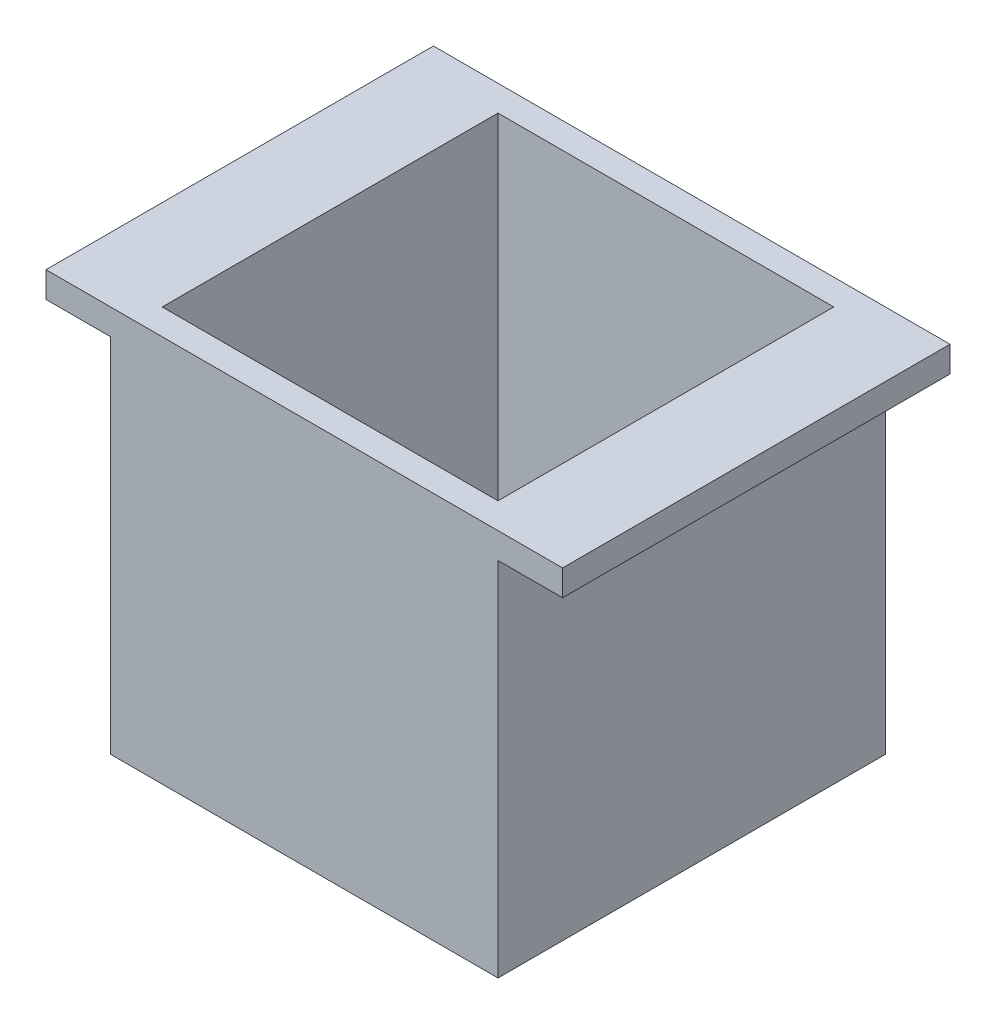
ISO-10303-21;
HEADER;
FILE_DESCRIPTION(('STEP AP214'),'2;1');
FILE_NAME('part.step','',(''),(''),'','','');
FILE_SCHEMA(('AUTOMOTIVE_DESIGN { 1 0 10303 214 1 1 1 1 }'));
ENDSEC;
DATA;
#1=APPLICATION_CONTEXT('core data for automotive mechanical design processes');
#2=APPLICATION_PROTOCOL_DEFINITION('international standard','automotive_design',2000,#1);
#3=PRODUCT_CONTEXT('',#1,'mechanical');
#4=PRODUCT('Part','Part','',(#3));
#5=PRODUCT_RELATED_PRODUCT_CATEGORY('part','',(#4));
#6=PRODUCT_DEFINITION_FORMATION('','',#4);
#7=PRODUCT_DEFINITION_CONTEXT('part definition',#1,'design');
#8=PRODUCT_DEFINITION('design','',#6,#7);
#9=PRODUCT_DEFINITION_SHAPE('','',#8);
#10=(LENGTH_UNIT() NAMED_UNIT(*) SI_UNIT(.MILLI.,.METRE.));
#11=(NAMED_UNIT(*) PLANE_ANGLE_UNIT() SI_UNIT($,.RADIAN.));
#12=(NAMED_UNIT(*) SI_UNIT($,.STERADIAN.) SOLID_ANGLE_UNIT());
#13=UNCERTAINTY_MEASURE_WITH_UNIT(LENGTH_MEASURE(1.E-05),#10,'distance_accuracy_value','');
#14=(GEOMETRIC_REPRESENTATION_CONTEXT(3) GLOBAL_UNCERTAINTY_ASSIGNED_CONTEXT((#13)) GLOBAL_UNIT_ASSIGNED_CONTEXT((#10,
#11,#12)) REPRESENTATION_CONTEXT('',''));
#15=CARTESIAN_POINT('',(0.,0.,0.));
#16=DIRECTION('',(0.,0.,1.));
#17=DIRECTION('',(1.,0.,0.));
#18=AXIS2_PLACEMENT_3D('',#15,#16,#17);
#19=CARTESIAN_POINT('',(30.,0.,30.));
#20=DIRECTION('',(0.,1.,0.));
#21=DIRECTION('',(0.,0.,1.));
#22=AXIS2_PLACEMENT_3D('',#19,#20,#21);
#23=PLANE('',#22);
#24=DIRECTION('',(1.,0.,0.));
#25=VECTOR('',#24,1.);
#26=CARTESIAN_POINT('',(30.,0.,0.));
#27=LINE('',#26,#25);
#28=CARTESIAN_POINT('',(0.,0.,0.));
#29=VERTEX_POINT('',#28);
#30=CARTESIAN_POINT('',(30.,0.,0.));
#31=VERTEX_POINT('',#30);
#32=EDGE_CURVE('E152',#29,#31,#27,.T.);
#33=ORIENTED_EDGE('',*,*,#32,.T.);
#34=DIRECTION('',(0.,0.,-1.));
#35=VECTOR('',#34,1.);
#36=CARTESIAN_POINT('',(30.,0.,30.));
#37=LINE('',#36,#35);
#38=CARTESIAN_POINT('',(30.,0.,30.));
#39=VERTEX_POINT('',#38);
#40=EDGE_CURVE('E11',#39,#31,#37,.T.);
#41=ORIENTED_EDGE('',*,*,#40,.F.);
#42=DIRECTION('',(1.,0.,0.));
#43=VECTOR('',#42,1.);
#44=CARTESIAN_POINT('',(30.,0.,30.));
#45=LINE('',#44,#43);
#46=CARTESIAN_POINT('',(0.,0.,30.));
#47=VERTEX_POINT('',#46);
#48=EDGE_CURVE('E176',#47,#39,#45,.T.);
#49=ORIENTED_EDGE('',*,*,#48,.F.);
#50=DIRECTION('',(0.,0.,-1.));
#51=VECTOR('',#50,1.);
#52=CARTESIAN_POINT('',(0.,0.,30.));
#53=LINE('',#52,#51);
#54=EDGE_CURVE('E148',#47,#29,#53,.T.);
#55=ORIENTED_EDGE('',*,*,#54,.T.);
#56=EDGE_LOOP('',(#33,#41,#49,#55));
#57=FACE_BOUND('',#56,.T.);
#58=ADVANCED_FACE('F39',(#57),#23,.F.);
#59=CARTESIAN_POINT('',(30.,28.,30.));
#60=DIRECTION('',(-1.,0.,0.));
#61=DIRECTION('',(0.,-1.,0.));
#62=AXIS2_PLACEMENT_3D('',#59,#60,#61);
#63=PLANE('',#62);
#64=DIRECTION('',(0.,1.,0.));
#65=VECTOR('',#64,1.);
#66=CARTESIAN_POINT('',(30.,28.,0.));
#67=LINE('',#66,#65);
#68=CARTESIAN_POINT('',(30.,28.,0.));
#69=VERTEX_POINT('',#68);
#70=EDGE_CURVE('E156',#31,#69,#67,.T.);
#71=ORIENTED_EDGE('',*,*,#70,.T.);
#72=DIRECTION('',(0.,0.,-1.));
#73=VECTOR('',#72,1.);
#74=CARTESIAN_POINT('',(30.,28.,30.));
#75=LINE('',#74,#73);
#76=CARTESIAN_POINT('',(30.,28.,30.));
#77=VERTEX_POINT('',#76);
#78=EDGE_CURVE('E47',#77,#69,#75,.T.);
#79=ORIENTED_EDGE('',*,*,#78,.F.);
#80=DIRECTION('',(0.,1.,0.));
#81=VECTOR('',#80,1.);
#82=CARTESIAN_POINT('',(30.,28.,30.));
#83=LINE('',#82,#81);
#84=EDGE_CURVE('E104',#39,#77,#83,.T.);
#85=ORIENTED_EDGE('',*,*,#84,.F.);
#86=ORIENTED_EDGE('',*,*,#40,.T.);
#87=EDGE_LOOP('',(#71,#79,#85,#86));
#88=FACE_BOUND('',#87,.T.);
#89=ADVANCED_FACE('F302',(#88),#63,.F.);
#90=CARTESIAN_POINT('',(35.,28.,30.));
#91=DIRECTION('',(0.,1.,0.));
#92=DIRECTION('',(0.,0.,1.));
#93=AXIS2_PLACEMENT_3D('',#90,#91,#92);
#94=PLANE('',#93);
#95=DIRECTION('',(1.,0.,0.));
#96=VECTOR('',#95,1.);
#97=CARTESIAN_POINT('',(35.,28.,0.));
#98=LINE('',#97,#96);
#99=CARTESIAN_POINT('',(35.,28.,0.));
#100=VERTEX_POINT('',#99);
#101=EDGE_CURVE('E160',#69,#100,#98,.T.);
#102=ORIENTED_EDGE('',*,*,#101,.T.);
#103=DIRECTION('',(0.,0.,-1.));
#104=VECTOR('',#103,1.);
#105=CARTESIAN_POINT('',(35.,28.,30.));
#106=LINE('',#105,#104);
#107=CARTESIAN_POINT('',(35.,28.,30.));
#108=VERTEX_POINT('',#107);
#109=EDGE_CURVE('E187',#108,#100,#106,.T.);
#110=ORIENTED_EDGE('',*,*,#109,.F.);
#111=DIRECTION('',(1.,0.,0.));
#112=VECTOR('',#111,1.);
#113=CARTESIAN_POINT('',(35.,28.,30.));
#114=LINE('',#113,#112);
#115=EDGE_CURVE('E197',#77,#108,#114,.T.);
#116=ORIENTED_EDGE('',*,*,#115,.F.);
#117=ORIENTED_EDGE('',*,*,#78,.T.);
#118=EDGE_LOOP('',(#102,#110,#116,#117));
#119=FACE_BOUND('',#118,.T.);
#120=ADVANCED_FACE('F195',(#119),#94,.F.);
#121=CARTESIAN_POINT('',(35.,30.,30.));
#122=DIRECTION('',(-1.,0.,0.));
#123=DIRECTION('',(0.,-1.,0.));
#124=AXIS2_PLACEMENT_3D('',#121,#122,#123);
#125=PLANE('',#124);
#126=DIRECTION('',(0.,1.,0.));
#127=VECTOR('',#126,1.);
#128=CARTESIAN_POINT('',(35.,30.,0.));
#129=LINE('',#128,#127);
#130=CARTESIAN_POINT('',(35.,30.,0.));
#131=VERTEX_POINT('',#130);
#132=EDGE_CURVE('E163',#100,#131,#129,.T.);
#133=ORIENTED_EDGE('',*,*,#132,.T.);
#134=DIRECTION('',(0.,0.,-1.));
#135=VECTOR('',#134,1.);
#136=CARTESIAN_POINT('',(35.,30.,30.));
#137=LINE('',#136,#135);
#138=CARTESIAN_POINT('',(35.,30.,30.));
#139=VERTEX_POINT('',#138);
#140=EDGE_CURVE('E183',#139,#131,#137,.T.);
#141=ORIENTED_EDGE('',*,*,#140,.F.);
#142=DIRECTION('',(0.,1.,0.));
#143=VECTOR('',#142,1.);
#144=CARTESIAN_POINT('',(35.,30.,30.));
#145=LINE('',#144,#143);
#146=EDGE_CURVE('E210',#108,#139,#145,.T.);
#147=ORIENTED_EDGE('',*,*,#146,.F.);
#148=ORIENTED_EDGE('',*,*,#109,.T.);
#149=EDGE_LOOP('',(#133,#141,#147,#148));
#150=FACE_BOUND('',#149,.T.);
#151=ADVANCED_FACE('F205',(#150),#125,.F.);
#152=CARTESIAN_POINT('',(-5.,30.,30.));
#153=DIRECTION('',(0.,-1.,0.));
#154=DIRECTION('',(0.,0.,-1.));
#155=AXIS2_PLACEMENT_3D('',#152,#153,#154);
#156=PLANE('',#155);
#157=DIRECTION('',(1.,0.,0.));
#158=VECTOR('',#157,1.);
#159=CARTESIAN_POINT('',(2.,30.,28.));
#160=LINE('',#159,#158);
#161=CARTESIAN_POINT('',(2.,30.,28.));
#162=VERTEX_POINT('',#161);
#163=CARTESIAN_POINT('',(28.,30.,28.));
#164=VERTEX_POINT('',#163);
#165=EDGE_CURVE('E243',#162,#164,#160,.T.);
#166=ORIENTED_EDGE('',*,*,#165,.F.);
#167=DIRECTION('',(0.,0.,1.));
#168=VECTOR('',#167,1.);
#169=CARTESIAN_POINT('',(2.,30.,28.));
#170=LINE('',#169,#168);
#171=CARTESIAN_POINT('',(2.,30.,2.00000000000001));
#172=VERTEX_POINT('',#171);
#173=EDGE_CURVE('E54',#172,#162,#170,.T.);
#174=ORIENTED_EDGE('',*,*,#173,.F.);
#175=DIRECTION('',(-1.,0.,0.));
#176=VECTOR('',#175,1.);
#177=CARTESIAN_POINT('',(2.,30.,2.00000000000001));
#178=LINE('',#177,#176);
#179=CARTESIAN_POINT('',(28.,30.,2.));
#180=VERTEX_POINT('',#179);
#181=EDGE_CURVE('E234',#180,#172,#178,.T.);
#182=ORIENTED_EDGE('',*,*,#181,.F.);
#183=DIRECTION('',(0.,0.,-1.));
#184=VECTOR('',#183,1.);
#185=CARTESIAN_POINT('',(28.,30.,28.));
#186=LINE('',#185,#184);
#187=EDGE_CURVE('E239',#164,#180,#186,.T.);
#188=ORIENTED_EDGE('',*,*,#187,.F.);
#189=EDGE_LOOP('',(#166,#174,#182,#188));
#190=FACE_BOUND('',#189,.T.);
#191=DIRECTION('',(-1.,0.,0.));
#192=VECTOR('',#191,1.);
#193=CARTESIAN_POINT('',(-5.,30.,0.));
#194=LINE('',#193,#192);
#195=CARTESIAN_POINT('',(-5.,30.,0.));
#196=VERTEX_POINT('',#195);
#197=EDGE_CURVE('E166',#131,#196,#194,.T.);
#198=ORIENTED_EDGE('',*,*,#197,.T.);
#199=DIRECTION('',(0.,0.,-1.));
#200=VECTOR('',#199,1.);
#201=CARTESIAN_POINT('',(-5.,30.,30.));
#202=LINE('',#201,#200);
#203=CARTESIAN_POINT('',(-5.,30.,30.));
#204=VERTEX_POINT('',#203);
#205=EDGE_CURVE('E141',#204,#196,#202,.T.);
#206=ORIENTED_EDGE('',*,*,#205,.F.);
#207=DIRECTION('',(-1.,0.,0.));
#208=VECTOR('',#207,1.);
#209=CARTESIAN_POINT('',(-5.,30.,30.));
#210=LINE('',#209,#208);
#211=EDGE_CURVE('E127',#139,#204,#210,.T.);
#212=ORIENTED_EDGE('',*,*,#211,.F.);
#213=ORIENTED_EDGE('',*,*,#140,.T.);
#214=EDGE_LOOP('',(#198,#206,#212,#213));
#215=FACE_BOUND('',#214,.T.);
#216=ADVANCED_FACE('F208',(#190,#215),#156,.F.);
#217=CARTESIAN_POINT('',(-5.,28.,30.));
#218=DIRECTION('',(1.,0.,0.));
#219=DIRECTION('',(0.,0.,-1.));
#220=AXIS2_PLACEMENT_3D('',#217,#218,#219);
#221=PLANE('',#220);
#222=DIRECTION('',(0.,-1.,0.));
#223=VECTOR('',#222,1.);
#224=CARTESIAN_POINT('',(-5.,28.,0.));
#225=LINE('',#224,#223);
#226=CARTESIAN_POINT('',(-5.,28.,0.));
#227=VERTEX_POINT('',#226);
#228=EDGE_CURVE('E137',#196,#227,#225,.T.);
#229=ORIENTED_EDGE('',*,*,#228,.T.);
#230=DIRECTION('',(0.,0.,-1.));
#231=VECTOR('',#230,1.);
#232=CARTESIAN_POINT('',(-5.,28.,30.));
#233=LINE('',#232,#231);
#234=CARTESIAN_POINT('',(-5.,28.,30.));
#235=VERTEX_POINT('',#234);
#236=EDGE_CURVE('E134',#235,#227,#233,.T.);
#237=ORIENTED_EDGE('',*,*,#236,.F.);
#238=DIRECTION('',(0.,-1.,0.));
#239=VECTOR('',#238,1.);
#240=CARTESIAN_POINT('',(-5.,28.,30.));
#241=LINE('',#240,#239);
#242=EDGE_CURVE('E120',#204,#235,#241,.T.);
#243=ORIENTED_EDGE('',*,*,#242,.F.);
#244=ORIENTED_EDGE('',*,*,#205,.T.);
#245=EDGE_LOOP('',(#229,#237,#243,#244));
#246=FACE_BOUND('',#245,.T.);
#247=ADVANCED_FACE('F135',(#246),#221,.F.);
#248=CARTESIAN_POINT('',(0.,28.,30.));
#249=DIRECTION('',(0.,1.,0.));
#250=DIRECTION('',(0.,0.,1.));
#251=AXIS2_PLACEMENT_3D('',#248,#249,#250);
#252=PLANE('',#251);
#253=DIRECTION('',(1.,0.,0.));
#254=VECTOR('',#253,1.);
#255=CARTESIAN_POINT('',(0.,28.,0.));
#256=LINE('',#255,#254);
#257=CARTESIAN_POINT('',(0.,28.,0.));
#258=VERTEX_POINT('',#257);
#259=EDGE_CURVE('E171',#227,#258,#256,.T.);
#260=ORIENTED_EDGE('',*,*,#259,.T.);
#261=DIRECTION('',(0.,0.,-1.));
#262=VECTOR('',#261,1.);
#263=CARTESIAN_POINT('',(0.,28.,30.));
#264=LINE('',#263,#262);
#265=CARTESIAN_POINT('',(0.,28.,30.));
#266=VERTEX_POINT('',#265);
#267=EDGE_CURVE('E142',#266,#258,#264,.T.);
#268=ORIENTED_EDGE('',*,*,#267,.F.);
#269=DIRECTION('',(1.,0.,0.));
#270=VECTOR('',#269,1.);
#271=CARTESIAN_POINT('',(0.,28.,30.));
#272=LINE('',#271,#270);
#273=EDGE_CURVE('E124',#235,#266,#272,.T.);
#274=ORIENTED_EDGE('',*,*,#273,.F.);
#275=ORIENTED_EDGE('',*,*,#236,.T.);
#276=EDGE_LOOP('',(#260,#268,#274,#275));
#277=FACE_BOUND('',#276,.T.);
#278=ADVANCED_FACE('F144',(#277),#252,.F.);
#279=CARTESIAN_POINT('',(0.,0.,30.));
#280=DIRECTION('',(1.,0.,0.));
#281=DIRECTION('',(0.,1.,0.));
#282=AXIS2_PLACEMENT_3D('',#279,#280,#281);
#283=PLANE('',#282);
#284=DIRECTION('',(0.,-1.,0.));
#285=VECTOR('',#284,1.);
#286=CARTESIAN_POINT('',(0.,0.,0.));
#287=LINE('',#286,#285);
#288=EDGE_CURVE('E96',#258,#29,#287,.T.);
#289=ORIENTED_EDGE('',*,*,#288,.T.);
#290=ORIENTED_EDGE('',*,*,#54,.F.);
#291=DIRECTION('',(0.,-1.,0.));
#292=VECTOR('',#291,1.);
#293=CARTESIAN_POINT('',(0.,0.,30.));
#294=LINE('',#293,#292);
#295=EDGE_CURVE('E63',#266,#47,#294,.T.);
#296=ORIENTED_EDGE('',*,*,#295,.F.);
#297=ORIENTED_EDGE('',*,*,#267,.T.);
#298=EDGE_LOOP('',(#289,#290,#296,#297));
#299=FACE_BOUND('',#298,.T.);
#300=ADVANCED_FACE('F309',(#299),#283,.F.);
#301=CARTESIAN_POINT('',(0.,0.,30.));
#302=DIRECTION('',(0.,0.,-1.));
#303=DIRECTION('',(-1.,0.,0.));
#304=AXIS2_PLACEMENT_3D('',#301,#302,#303);
#305=PLANE('',#304);
#306=ORIENTED_EDGE('',*,*,#48,.T.);
#307=ORIENTED_EDGE('',*,*,#84,.T.);
#308=ORIENTED_EDGE('',*,*,#115,.T.);
#309=ORIENTED_EDGE('',*,*,#146,.T.);
#310=ORIENTED_EDGE('',*,*,#211,.T.);
#311=ORIENTED_EDGE('',*,*,#242,.T.);
#312=ORIENTED_EDGE('',*,*,#273,.T.);
#313=ORIENTED_EDGE('',*,*,#295,.T.);
#314=EDGE_LOOP('',(#306,#307,#308,#309,#310,#311,#312,#313));
#315=FACE_BOUND('',#314,.T.);
#316=ADVANCED_FACE('F122',(#315),#305,.F.);
#317=CARTESIAN_POINT('',(0.,0.,0.));
#318=DIRECTION('',(0.,0.,-1.));
#319=DIRECTION('',(-1.,0.,0.));
#320=AXIS2_PLACEMENT_3D('',#317,#318,#319);
#321=PLANE('',#320);
#322=ORIENTED_EDGE('',*,*,#32,.F.);
#323=ORIENTED_EDGE('',*,*,#288,.F.);
#324=ORIENTED_EDGE('',*,*,#259,.F.);
#325=ORIENTED_EDGE('',*,*,#228,.F.);
#326=ORIENTED_EDGE('',*,*,#197,.F.);
#327=ORIENTED_EDGE('',*,*,#132,.F.);
#328=ORIENTED_EDGE('',*,*,#101,.F.);
#329=ORIENTED_EDGE('',*,*,#70,.F.);
#330=EDGE_LOOP('',(#322,#323,#324,#325,#326,#327,#328,#329));
#331=FACE_BOUND('',#330,.T.);
#332=ADVANCED_FACE('F201',(#331),#321,.T.);
#333=CARTESIAN_POINT('',(2.,2.,28.));
#334=DIRECTION('',(-1.,0.,0.));
#335=DIRECTION('',(0.,0.,1.));
#336=AXIS2_PLACEMENT_3D('',#333,#334,#335);
#337=PLANE('',#336);
#338=ORIENTED_EDGE('',*,*,#173,.T.);
#339=DIRECTION('',(0.,1.,0.));
#340=VECTOR('',#339,1.);
#341=CARTESIAN_POINT('',(2.,2.,28.));
#342=LINE('',#341,#340);
#343=CARTESIAN_POINT('',(2.,2.,28.));
#344=VERTEX_POINT('',#343);
#345=EDGE_CURVE('E220',#344,#162,#342,.T.);
#346=ORIENTED_EDGE('',*,*,#345,.F.);
#347=DIRECTION('',(0.,0.,1.));
#348=VECTOR('',#347,1.);
#349=CARTESIAN_POINT('',(2.,2.,28.));
#350=LINE('',#349,#348);
#351=CARTESIAN_POINT('',(2.,2.,2.00000000000001));
#352=VERTEX_POINT('',#351);
#353=EDGE_CURVE('E238',#352,#344,#350,.T.);
#354=ORIENTED_EDGE('',*,*,#353,.F.);
#355=DIRECTION('',(0.,1.,0.));
#356=VECTOR('',#355,1.);
#357=CARTESIAN_POINT('',(2.,2.,2.00000000000001));
#358=LINE('',#357,#356);
#359=EDGE_CURVE('E157',#352,#172,#358,.T.);
#360=ORIENTED_EDGE('',*,*,#359,.T.);
#361=EDGE_LOOP('',(#338,#346,#354,#360));
#362=FACE_BOUND('',#361,.T.);
#363=ADVANCED_FACE('F270',(#362),#337,.F.);
#364=CARTESIAN_POINT('',(2.,2.,2.00000000000001));
#365=DIRECTION('',(0.,0.,-1.));
#366=DIRECTION('',(-1.,0.,0.));
#367=AXIS2_PLACEMENT_3D('',#364,#365,#366);
#368=PLANE('',#367);
#369=ORIENTED_EDGE('',*,*,#181,.T.);
#370=ORIENTED_EDGE('',*,*,#359,.F.);
#371=DIRECTION('',(-1.,0.,0.));
#372=VECTOR('',#371,1.);
#373=CARTESIAN_POINT('',(2.,2.,2.00000000000001));
#374=LINE('',#373,#372);
#375=CARTESIAN_POINT('',(28.,2.,2.));
#376=VERTEX_POINT('',#375);
#377=EDGE_CURVE('E224',#376,#352,#374,.T.);
#378=ORIENTED_EDGE('',*,*,#377,.F.);
#379=DIRECTION('',(0.,1.,0.));
#380=VECTOR('',#379,1.);
#381=CARTESIAN_POINT('',(28.,2.,2.));
#382=LINE('',#381,#380);
#383=EDGE_CURVE('E228',#376,#180,#382,.T.);
#384=ORIENTED_EDGE('',*,*,#383,.T.);
#385=EDGE_LOOP('',(#369,#370,#378,#384));
#386=FACE_BOUND('',#385,.T.);
#387=ADVANCED_FACE('F281',(#386),#368,.F.);
#388=CARTESIAN_POINT('',(28.,2.,28.));
#389=DIRECTION('',(1.,0.,0.));
#390=DIRECTION('',(0.,0.,-1.));
#391=AXIS2_PLACEMENT_3D('',#388,#389,#390);
#392=PLANE('',#391);
#393=ORIENTED_EDGE('',*,*,#187,.T.);
#394=ORIENTED_EDGE('',*,*,#383,.F.);
#395=DIRECTION('',(0.,0.,-1.));
#396=VECTOR('',#395,1.);
#397=CARTESIAN_POINT('',(28.,2.,28.));
#398=LINE('',#397,#396);
#399=CARTESIAN_POINT('',(28.,2.,28.));
#400=VERTEX_POINT('',#399);
#401=EDGE_CURVE('E252',#400,#376,#398,.T.);
#402=ORIENTED_EDGE('',*,*,#401,.F.);
#403=DIRECTION('',(0.,1.,0.));
#404=VECTOR('',#403,1.);
#405=CARTESIAN_POINT('',(28.,2.,28.));
#406=LINE('',#405,#404);
#407=EDGE_CURVE('E223',#400,#164,#406,.T.);
#408=ORIENTED_EDGE('',*,*,#407,.T.);
#409=EDGE_LOOP('',(#393,#394,#402,#408));
#410=FACE_BOUND('',#409,.T.);
#411=ADVANCED_FACE('F286',(#410),#392,.F.);
#412=CARTESIAN_POINT('',(2.,2.,28.));
#413=DIRECTION('',(0.,0.,1.));
#414=DIRECTION('',(1.,0.,0.));
#415=AXIS2_PLACEMENT_3D('',#412,#413,#414);
#416=PLANE('',#415);
#417=ORIENTED_EDGE('',*,*,#165,.T.);
#418=ORIENTED_EDGE('',*,*,#407,.F.);
#419=DIRECTION('',(1.,0.,0.));
#420=VECTOR('',#419,1.);
#421=CARTESIAN_POINT('',(2.,2.,28.));
#422=LINE('',#421,#420);
#423=EDGE_CURVE('E256',#344,#400,#422,.T.);
#424=ORIENTED_EDGE('',*,*,#423,.F.);
#425=ORIENTED_EDGE('',*,*,#345,.T.);
#426=EDGE_LOOP('',(#417,#418,#424,#425));
#427=FACE_BOUND('',#426,.T.);
#428=ADVANCED_FACE('F291',(#427),#416,.F.);
#429=CARTESIAN_POINT('',(0.,2.,0.));
#430=DIRECTION('',(0.,-1.,0.));
#431=DIRECTION('',(0.,0.,-1.));
#432=AXIS2_PLACEMENT_3D('',#429,#430,#431);
#433=PLANE('',#432);
#434=ORIENTED_EDGE('',*,*,#353,.T.);
#435=ORIENTED_EDGE('',*,*,#423,.T.);
#436=ORIENTED_EDGE('',*,*,#401,.T.);
#437=ORIENTED_EDGE('',*,*,#377,.T.);
#438=EDGE_LOOP('',(#434,#435,#436,#437));
#439=FACE_BOUND('',#438,.T.);
#440=ADVANCED_FACE('F265',(#439),#433,.F.);
#441=CLOSED_SHELL('',(#58,#89,#120,#151,#216,#247,#278,#300,#316,#332,#363,#387,#411,#428,#440));
#442=MANIFOLD_SOLID_BREP('B2',#441);
#443=ADVANCED_BREP_SHAPE_REPRESENTATION('',(#18,#442),#14);
#444=SHAPE_DEFINITION_REPRESENTATION(#9,#443);
ENDSEC;
END-ISO-10303-21;
